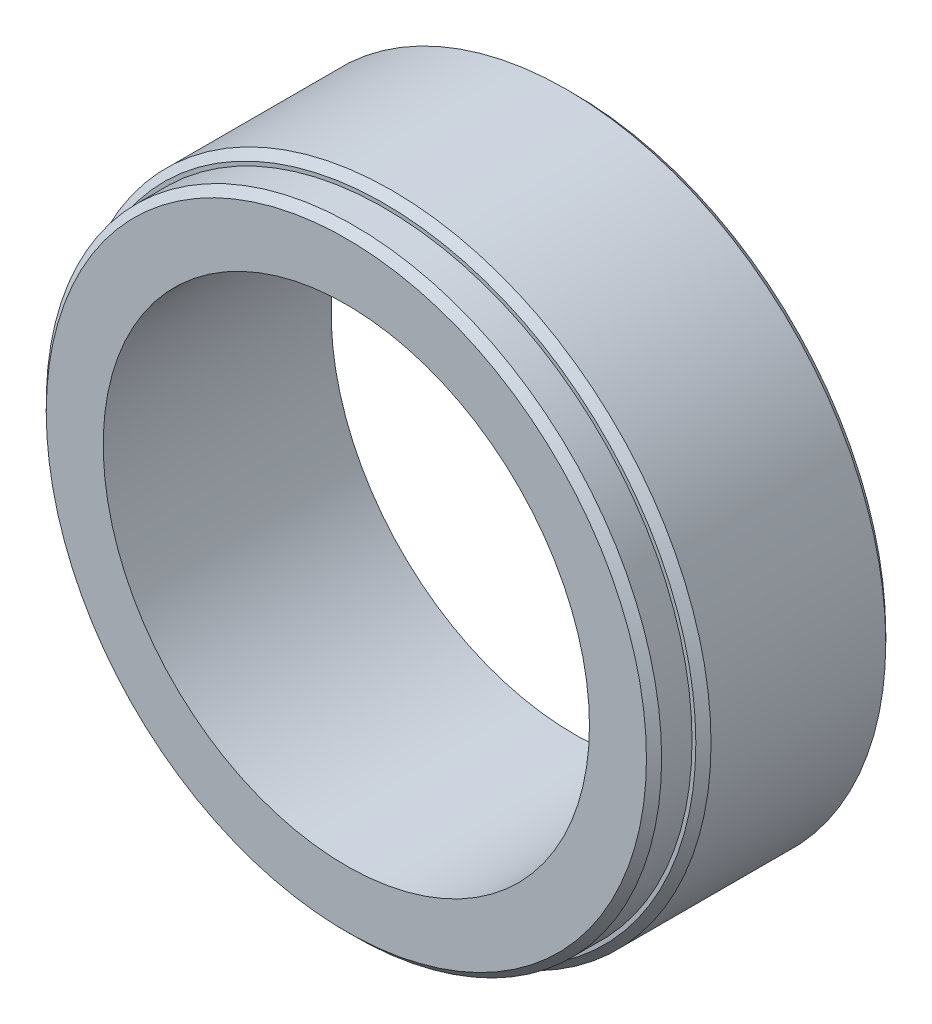
ISO-10303-21;
HEADER;
FILE_DESCRIPTION(('STEP AP214'),'2;1');
FILE_NAME('part.step','',(''),(''),'','','');
FILE_SCHEMA(('AUTOMOTIVE_DESIGN { 1 0 10303 214 1 1 1 1 }'));
ENDSEC;
DATA;
#1=APPLICATION_CONTEXT('core data for automotive mechanical design processes');
#2=APPLICATION_PROTOCOL_DEFINITION('international standard','automotive_design',2000,#1);
#3=PRODUCT_CONTEXT('',#1,'mechanical');
#4=PRODUCT('Part','Part','',(#3));
#5=PRODUCT_RELATED_PRODUCT_CATEGORY('part','',(#4));
#6=PRODUCT_DEFINITION_FORMATION('','',#4);
#7=PRODUCT_DEFINITION_CONTEXT('part definition',#1,'design');
#8=PRODUCT_DEFINITION('design','',#6,#7);
#9=PRODUCT_DEFINITION_SHAPE('','',#8);
#10=(LENGTH_UNIT() NAMED_UNIT(*) SI_UNIT(.MILLI.,.METRE.));
#11=(NAMED_UNIT(*) PLANE_ANGLE_UNIT() SI_UNIT($,.RADIAN.));
#12=(NAMED_UNIT(*) SI_UNIT($,.STERADIAN.) SOLID_ANGLE_UNIT());
#13=UNCERTAINTY_MEASURE_WITH_UNIT(LENGTH_MEASURE(1.E-05),#10,'distance_accuracy_value','');
#14=(GEOMETRIC_REPRESENTATION_CONTEXT(3) GLOBAL_UNCERTAINTY_ASSIGNED_CONTEXT((#13)) GLOBAL_UNIT_ASSIGNED_CONTEXT((#10,
#11,#12)) REPRESENTATION_CONTEXT('',''));
#15=CARTESIAN_POINT('',(0.,0.,0.));
#16=DIRECTION('',(0.,0.,1.));
#17=DIRECTION('',(1.,0.,0.));
#18=AXIS2_PLACEMENT_3D('',#15,#16,#17);
#19=CARTESIAN_POINT('',(0.,0.,25.));
#20=DIRECTION('',(0.,0.,1.));
#21=DIRECTION('',(1.,0.,0.));
#22=AXIS2_PLACEMENT_3D('',#19,#20,#21);
#23=PLANE('',#22);
#24=CARTESIAN_POINT('',(0.,0.,25.));
#25=DIRECTION('',(0.,0.,1.));
#26=DIRECTION('',(1.,0.,0.));
#27=AXIS2_PLACEMENT_3D('',#24,#25,#26);
#28=CIRCLE('',#27,41.);
#29=CARTESIAN_POINT('',(41.,0.,25.));
#30=VERTEX_POINT('',#29);
#31=EDGE_CURVE('E51',#30,#30,#28,.T.);
#32=ORIENTED_EDGE('',*,*,#31,.T.);
#33=EDGE_LOOP('',(#32));
#34=FACE_BOUND('',#33,.T.);
#35=CARTESIAN_POINT('',(0.,0.,25.));
#36=DIRECTION('',(0.,0.,1.));
#37=DIRECTION('',(1.,0.,0.));
#38=AXIS2_PLACEMENT_3D('',#35,#36,#37);
#39=CIRCLE('',#38,40.5);
#40=CARTESIAN_POINT('',(40.5,0.,25.));
#41=VERTEX_POINT('',#40);
#42=EDGE_CURVE('E66',#41,#41,#39,.T.);
#43=ORIENTED_EDGE('',*,*,#42,.F.);
#44=EDGE_LOOP('',(#43));
#45=FACE_BOUND('',#44,.T.);
#46=ADVANCED_FACE('F39',(#34,#45),#23,.T.);
#47=CARTESIAN_POINT('',(0.,0.,0.));
#48=DIRECTION('',(0.,0.,1.));
#49=DIRECTION('',(1.,0.,0.));
#50=AXIS2_PLACEMENT_3D('',#47,#48,#49);
#51=PLANE('',#50);
#52=CARTESIAN_POINT('',(0.,0.,0.));
#53=DIRECTION('',(0.,0.,1.));
#54=DIRECTION('',(1.,0.,0.));
#55=AXIS2_PLACEMENT_3D('',#52,#53,#54);
#56=CIRCLE('',#55,41.);
#57=CARTESIAN_POINT('',(41.,0.,0.));
#58=VERTEX_POINT('',#57);
#59=EDGE_CURVE('E55',#58,#58,#56,.F.);
#60=ORIENTED_EDGE('',*,*,#59,.T.);
#61=EDGE_LOOP('',(#60));
#62=FACE_BOUND('',#61,.T.);
#63=CARTESIAN_POINT('',(0.,0.,0.));
#64=DIRECTION('',(0.,0.,1.));
#65=DIRECTION('',(1.,0.,0.));
#66=AXIS2_PLACEMENT_3D('',#63,#64,#65);
#67=CIRCLE('',#66,32.);
#68=CARTESIAN_POINT('',(32.,0.,0.));
#69=VERTEX_POINT('',#68);
#70=EDGE_CURVE('E67',#69,#69,#67,.T.);
#71=ORIENTED_EDGE('',*,*,#70,.T.);
#72=EDGE_LOOP('',(#71));
#73=FACE_BOUND('',#72,.T.);
#74=ADVANCED_FACE('F92',(#62,#73),#51,.F.);
#75=CARTESIAN_POINT('',(0.,0.,25.));
#76=DIRECTION('',(0.,0.,-1.));
#77=DIRECTION('',(-1.,0.,0.));
#78=AXIS2_PLACEMENT_3D('',#75,#76,#77);
#79=CYLINDRICAL_SURFACE('',#78,42.);
#80=CARTESIAN_POINT('',(0.,0.,1.00000000000001));
#81=DIRECTION('',(0.,0.,1.));
#82=DIRECTION('',(1.,0.,0.));
#83=AXIS2_PLACEMENT_3D('',#80,#81,#82);
#84=CIRCLE('',#83,42.);
#85=CARTESIAN_POINT('',(42.,0.,1.00000000000001));
#86=VERTEX_POINT('',#85);
#87=EDGE_CURVE('E60',#86,#86,#84,.T.);
#88=ORIENTED_EDGE('',*,*,#87,.T.);
#89=EDGE_LOOP('',(#88));
#90=FACE_BOUND('',#89,.T.);
#91=CARTESIAN_POINT('',(0.,0.,24.));
#92=DIRECTION('',(0.,0.,1.));
#93=DIRECTION('',(1.,0.,0.));
#94=AXIS2_PLACEMENT_3D('',#91,#92,#93);
#95=CIRCLE('',#94,42.);
#96=CARTESIAN_POINT('',(42.,0.,24.));
#97=VERTEX_POINT('',#96);
#98=EDGE_CURVE('E63',#97,#97,#95,.F.);
#99=ORIENTED_EDGE('',*,*,#98,.T.);
#100=EDGE_LOOP('',(#99));
#101=FACE_BOUND('',#100,.T.);
#102=ADVANCED_FACE('F88',(#90,#101),#79,.T.);
#103=CARTESIAN_POINT('',(0.,0.,25.));
#104=DIRECTION('',(0.,0.,-1.));
#105=DIRECTION('',(-1.,0.,0.));
#106=AXIS2_PLACEMENT_3D('',#103,#104,#105);
#107=CYLINDRICAL_SURFACE('',#106,32.);
#108=ORIENTED_EDGE('',*,*,#70,.F.);
#109=EDGE_LOOP('',(#108));
#110=FACE_BOUND('',#109,.T.);
#111=CARTESIAN_POINT('',(0.,0.,30.));
#112=DIRECTION('',(0.,0.,1.));
#113=DIRECTION('',(1.,0.,0.));
#114=AXIS2_PLACEMENT_3D('',#111,#112,#113);
#115=CIRCLE('',#114,32.);
#116=CARTESIAN_POINT('',(32.,0.,30.));
#117=VERTEX_POINT('',#116);
#118=EDGE_CURVE('E70',#117,#117,#115,.T.);
#119=ORIENTED_EDGE('',*,*,#118,.T.);
#120=EDGE_LOOP('',(#119));
#121=FACE_BOUND('',#120,.T.);
#122=ADVANCED_FACE('F76',(#110,#121),#107,.F.);
#123=CARTESIAN_POINT('',(0.,0.,30.));
#124=DIRECTION('',(0.,0.,1.));
#125=DIRECTION('',(1.,0.,0.));
#126=AXIS2_PLACEMENT_3D('',#123,#124,#125);
#127=PLANE('',#126);
#128=CARTESIAN_POINT('',(0.,0.,30.));
#129=DIRECTION('',(0.,0.,1.));
#130=DIRECTION('',(1.,0.,0.));
#131=AXIS2_PLACEMENT_3D('',#128,#129,#130);
#132=CIRCLE('',#131,39.5);
#133=CARTESIAN_POINT('',(39.5,0.,30.));
#134=VERTEX_POINT('',#133);
#135=EDGE_CURVE('E47',#134,#134,#132,.T.);
#136=ORIENTED_EDGE('',*,*,#135,.T.);
#137=EDGE_LOOP('',(#136));
#138=FACE_BOUND('',#137,.T.);
#139=ORIENTED_EDGE('',*,*,#118,.F.);
#140=EDGE_LOOP('',(#139));
#141=FACE_BOUND('',#140,.T.);
#142=ADVANCED_FACE('F78',(#138,#141),#127,.T.);
#143=CARTESIAN_POINT('',(0.,0.,30.));
#144=DIRECTION('',(0.,0.,-1.));
#145=DIRECTION('',(-1.,0.,0.));
#146=AXIS2_PLACEMENT_3D('',#143,#144,#145);
#147=CYLINDRICAL_SURFACE('',#146,40.5);
#148=CARTESIAN_POINT('',(0.,0.,29.));
#149=DIRECTION('',(0.,0.,1.));
#150=DIRECTION('',(1.,0.,0.));
#151=AXIS2_PLACEMENT_3D('',#148,#149,#150);
#152=CIRCLE('',#151,40.5);
#153=CARTESIAN_POINT('',(40.5,0.,29.));
#154=VERTEX_POINT('',#153);
#155=EDGE_CURVE('E10',#154,#154,#152,.F.);
#156=ORIENTED_EDGE('',*,*,#155,.T.);
#157=EDGE_LOOP('',(#156));
#158=FACE_BOUND('',#157,.T.);
#159=ORIENTED_EDGE('',*,*,#42,.T.);
#160=EDGE_LOOP('',(#159));
#161=FACE_BOUND('',#160,.T.);
#162=ADVANCED_FACE('F80',(#158,#161),#147,.T.);
#163=CARTESIAN_POINT('',(0.,0.,1.00000000000001));
#164=DIRECTION('',(0.,0.,1.));
#165=DIRECTION('',(1.,0.,0.));
#166=AXIS2_PLACEMENT_3D('',#163,#164,#165);
#167=CONICAL_SURFACE('',#166,42.,0.785398163397448);
#168=ORIENTED_EDGE('',*,*,#59,.F.);
#169=EDGE_LOOP('',(#168));
#170=FACE_BOUND('',#169,.T.);
#171=ORIENTED_EDGE('',*,*,#87,.F.);
#172=EDGE_LOOP('',(#171));
#173=FACE_BOUND('',#172,.T.);
#174=ADVANCED_FACE('F86',(#170,#173),#167,.T.);
#175=CARTESIAN_POINT('',(0.,0.,25.));
#176=DIRECTION('',(0.,0.,-1.));
#177=DIRECTION('',(-1.,0.,0.));
#178=AXIS2_PLACEMENT_3D('',#175,#176,#177);
#179=CONICAL_SURFACE('',#178,41.,0.785398163397448);
#180=ORIENTED_EDGE('',*,*,#98,.F.);
#181=EDGE_LOOP('',(#180));
#182=FACE_BOUND('',#181,.T.);
#183=ORIENTED_EDGE('',*,*,#31,.F.);
#184=EDGE_LOOP('',(#183));
#185=FACE_BOUND('',#184,.T.);
#186=ADVANCED_FACE('F110',(#182,#185),#179,.T.);
#187=CARTESIAN_POINT('',(0.,0.,30.));
#188=DIRECTION('',(0.,0.,-1.));
#189=DIRECTION('',(-1.,0.,0.));
#190=AXIS2_PLACEMENT_3D('',#187,#188,#189);
#191=CONICAL_SURFACE('',#190,39.5,0.785398163397452);
#192=ORIENTED_EDGE('',*,*,#155,.F.);
#193=EDGE_LOOP('',(#192));
#194=FACE_BOUND('',#193,.T.);
#195=ORIENTED_EDGE('',*,*,#135,.F.);
#196=EDGE_LOOP('',(#195));
#197=FACE_BOUND('',#196,.T.);
#198=ADVANCED_FACE('F42',(#194,#197),#191,.T.);
#199=CLOSED_SHELL('',(#46,#74,#102,#122,#142,#162,#174,#186,#198));
#200=MANIFOLD_SOLID_BREP('B2',#199);
#201=ADVANCED_BREP_SHAPE_REPRESENTATION('',(#18,#200),#14);
#202=SHAPE_DEFINITION_REPRESENTATION(#9,#201);
ENDSEC;
END-ISO-10303-21;
